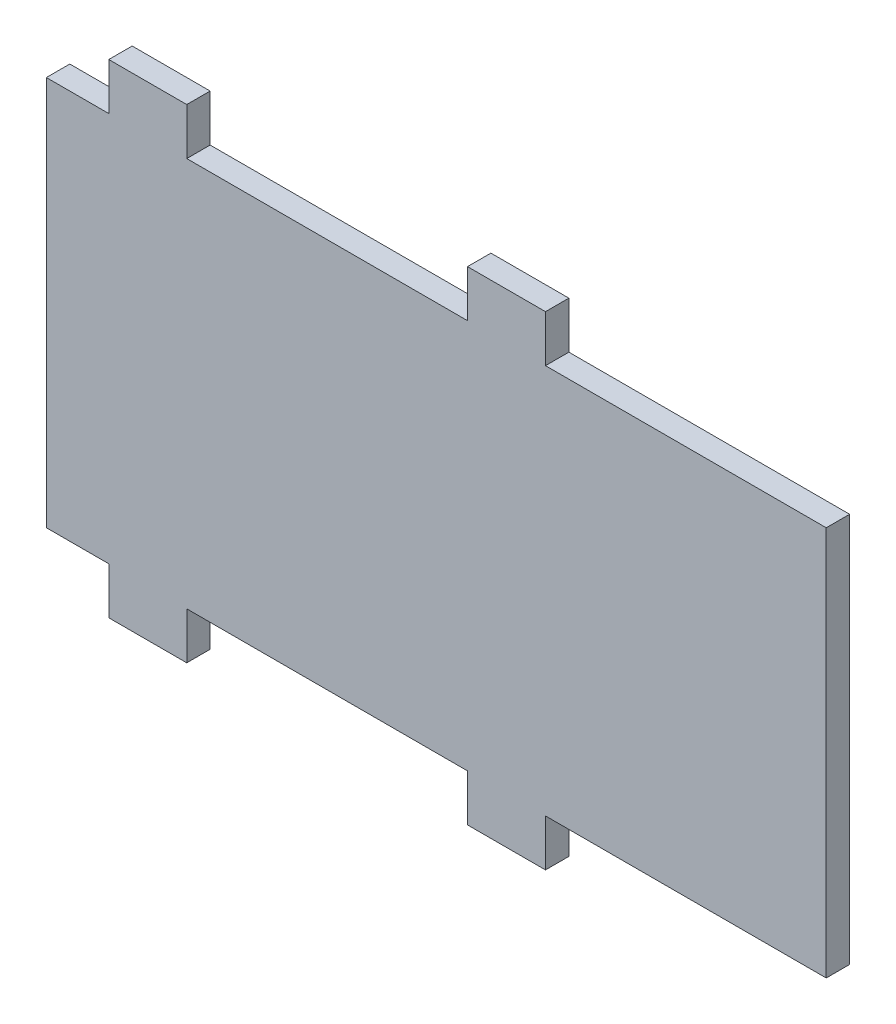
ISO-10303-21;
HEADER;
FILE_DESCRIPTION(('STEP AP214'),'2;1');
FILE_NAME('part.step','',(''),(''),'','','');
FILE_SCHEMA(('AUTOMOTIVE_DESIGN { 1 0 10303 214 1 1 1 1 }'));
ENDSEC;
DATA;
#1=APPLICATION_CONTEXT('core data for automotive mechanical design processes');
#2=APPLICATION_PROTOCOL_DEFINITION('international standard','automotive_design',2000,#1);
#3=PRODUCT_CONTEXT('',#1,'mechanical');
#4=PRODUCT('Part','Part','',(#3));
#5=PRODUCT_RELATED_PRODUCT_CATEGORY('part','',(#4));
#6=PRODUCT_DEFINITION_FORMATION('','',#4);
#7=PRODUCT_DEFINITION_CONTEXT('part definition',#1,'design');
#8=PRODUCT_DEFINITION('design','',#6,#7);
#9=PRODUCT_DEFINITION_SHAPE('','',#8);
#10=(LENGTH_UNIT() NAMED_UNIT(*) SI_UNIT(.MILLI.,.METRE.));
#11=(NAMED_UNIT(*) PLANE_ANGLE_UNIT() SI_UNIT($,.RADIAN.));
#12=(NAMED_UNIT(*) SI_UNIT($,.STERADIAN.) SOLID_ANGLE_UNIT());
#13=UNCERTAINTY_MEASURE_WITH_UNIT(LENGTH_MEASURE(1.E-05),#10,'distance_accuracy_value','');
#14=(GEOMETRIC_REPRESENTATION_CONTEXT(3) GLOBAL_UNCERTAINTY_ASSIGNED_CONTEXT((#13)) GLOBAL_UNIT_ASSIGNED_CONTEXT((#10,
#11,#12)) REPRESENTATION_CONTEXT('',''));
#15=CARTESIAN_POINT('',(0.,0.,0.));
#16=DIRECTION('',(0.,0.,1.));
#17=DIRECTION('',(1.,0.,0.));
#18=AXIS2_PLACEMENT_3D('',#15,#16,#17);
#19=CARTESIAN_POINT('',(-100.,62.,3.));
#20=DIRECTION('',(0.,-1.,0.));
#21=DIRECTION('',(1.,0.,0.));
#22=AXIS2_PLACEMENT_3D('',#19,#20,#21);
#23=PLANE('',#22);
#24=DIRECTION('',(-1.,0.,0.));
#25=VECTOR('',#24,1.);
#26=CARTESIAN_POINT('',(-100.,62.,0.));
#27=LINE('',#26,#25);
#28=CARTESIAN_POINT('',(-36.,62.,0.));
#29=VERTEX_POINT('',#28);
#30=CARTESIAN_POINT('',(-46.,62.,0.));
#31=VERTEX_POINT('',#30);
#32=EDGE_CURVE('E194',#29,#31,#27,.T.);
#33=ORIENTED_EDGE('',*,*,#32,.T.);
#34=DIRECTION('',(0.,0.,1.));
#35=VECTOR('',#34,1.);
#36=CARTESIAN_POINT('',(-46.,62.,0.));
#37=LINE('',#36,#35);
#38=CARTESIAN_POINT('',(-46.,62.,3.));
#39=VERTEX_POINT('',#38);
#40=EDGE_CURVE('E284',#31,#39,#37,.T.);
#41=ORIENTED_EDGE('',*,*,#40,.T.);
#42=DIRECTION('',(-1.,0.,0.));
#43=VECTOR('',#42,1.);
#44=CARTESIAN_POINT('',(-100.,62.,3.));
#45=LINE('',#44,#43);
#46=CARTESIAN_POINT('',(-36.,62.,3.));
#47=VERTEX_POINT('',#46);
#48=EDGE_CURVE('E205',#47,#39,#45,.T.);
#49=ORIENTED_EDGE('',*,*,#48,.F.);
#50=DIRECTION('',(0.,0.,1.));
#51=VECTOR('',#50,1.);
#52=CARTESIAN_POINT('',(-36.,62.,0.));
#53=LINE('',#52,#51);
#54=EDGE_CURVE('E271',#29,#47,#53,.T.);
#55=ORIENTED_EDGE('',*,*,#54,.F.);
#56=EDGE_LOOP('',(#33,#41,#49,#55));
#57=FACE_BOUND('',#56,.T.);
#58=ADVANCED_FACE('F32',(#57),#23,.F.);
#59=CARTESIAN_POINT('',(0.,0.,3.));
#60=DIRECTION('',(0.,1.,0.));
#61=DIRECTION('',(-1.,0.,0.));
#62=AXIS2_PLACEMENT_3D('',#59,#60,#61);
#63=PLANE('',#62);
#64=DIRECTION('',(1.,0.,0.));
#65=VECTOR('',#64,1.);
#66=CARTESIAN_POINT('',(0.,0.,0.));
#67=LINE('',#66,#65);
#68=CARTESIAN_POINT('',(-92.,0.,0.));
#69=VERTEX_POINT('',#68);
#70=CARTESIAN_POINT('',(-82.,0.,0.));
#71=VERTEX_POINT('',#70);
#72=EDGE_CURVE('E36',#69,#71,#67,.T.);
#73=ORIENTED_EDGE('',*,*,#72,.T.);
#74=DIRECTION('',(0.,0.,1.));
#75=VECTOR('',#74,1.);
#76=CARTESIAN_POINT('',(-82.,0.,0.));
#77=LINE('',#76,#75);
#78=CARTESIAN_POINT('',(-82.,0.,3.));
#79=VERTEX_POINT('',#78);
#80=EDGE_CURVE('E227',#71,#79,#77,.T.);
#81=ORIENTED_EDGE('',*,*,#80,.T.);
#82=DIRECTION('',(1.,0.,0.));
#83=VECTOR('',#82,1.);
#84=CARTESIAN_POINT('',(0.,0.,3.));
#85=LINE('',#84,#83);
#86=CARTESIAN_POINT('',(-92.,0.,3.));
#87=VERTEX_POINT('',#86);
#88=EDGE_CURVE('E11',#87,#79,#85,.T.);
#89=ORIENTED_EDGE('',*,*,#88,.F.);
#90=DIRECTION('',(0.,0.,1.));
#91=VECTOR('',#90,1.);
#92=CARTESIAN_POINT('',(-92.,0.,0.));
#93=LINE('',#92,#91);
#94=EDGE_CURVE('E212',#69,#87,#93,.T.);
#95=ORIENTED_EDGE('',*,*,#94,.F.);
#96=EDGE_LOOP('',(#73,#81,#89,#95));
#97=FACE_BOUND('',#96,.T.);
#98=ADVANCED_FACE('F380',(#97),#63,.F.);
#99=CARTESIAN_POINT('',(0.,0.,3.));
#100=DIRECTION('',(-1.,0.,0.));
#101=DIRECTION('',(0.,0.,1.));
#102=AXIS2_PLACEMENT_3D('',#99,#100,#101);
#103=PLANE('',#102);
#104=DIRECTION('',(0.,1.,0.));
#105=VECTOR('',#104,1.);
#106=CARTESIAN_POINT('',(0.,0.,0.));
#107=LINE('',#106,#105);
#108=CARTESIAN_POINT('',(0.,5.99999999999999,0.));
#109=VERTEX_POINT('',#108);
#110=CARTESIAN_POINT('',(0.,56.,0.));
#111=VERTEX_POINT('',#110);
#112=EDGE_CURVE('E200',#109,#111,#107,.T.);
#113=ORIENTED_EDGE('',*,*,#112,.T.);
#114=DIRECTION('',(0.,0.,1.));
#115=VECTOR('',#114,1.);
#116=CARTESIAN_POINT('',(0.,56.,0.));
#117=LINE('',#116,#115);
#118=CARTESIAN_POINT('',(0.,56.,3.));
#119=VERTEX_POINT('',#118);
#120=EDGE_CURVE('E266',#111,#119,#117,.T.);
#121=ORIENTED_EDGE('',*,*,#120,.T.);
#122=DIRECTION('',(0.,1.,0.));
#123=VECTOR('',#122,1.);
#124=CARTESIAN_POINT('',(0.,0.,3.));
#125=LINE('',#124,#123);
#126=CARTESIAN_POINT('',(0.,5.99999999999999,3.));
#127=VERTEX_POINT('',#126);
#128=EDGE_CURVE('E209',#127,#119,#125,.T.);
#129=ORIENTED_EDGE('',*,*,#128,.F.);
#130=DIRECTION('',(0.,0.,1.));
#131=VECTOR('',#130,1.);
#132=CARTESIAN_POINT('',(0.,5.99999999999999,0.));
#133=LINE('',#132,#131);
#134=EDGE_CURVE('E256',#109,#127,#133,.T.);
#135=ORIENTED_EDGE('',*,*,#134,.F.);
#136=EDGE_LOOP('',(#113,#121,#129,#135));
#137=FACE_BOUND('',#136,.T.);
#138=ADVANCED_FACE('F34',(#137),#103,.F.);
#139=CARTESIAN_POINT('',(-82.,62.,0.));
#140=VERTEX_POINT('',#139);
#141=CARTESIAN_POINT('',(-92.,62.,0.));
#142=VERTEX_POINT('',#141);
#143=EDGE_CURVE('E197',#140,#142,#27,.T.);
#144=ORIENTED_EDGE('',*,*,#143,.T.);
#145=DIRECTION('',(0.,0.,1.));
#146=VECTOR('',#145,1.);
#147=CARTESIAN_POINT('',(-92.,62.,0.));
#148=LINE('',#147,#146);
#149=CARTESIAN_POINT('',(-92.,62.,3.));
#150=VERTEX_POINT('',#149);
#151=EDGE_CURVE('E307',#142,#150,#148,.T.);
#152=ORIENTED_EDGE('',*,*,#151,.T.);
#153=CARTESIAN_POINT('',(-82.,62.,3.));
#154=VERTEX_POINT('',#153);
#155=EDGE_CURVE('E208',#154,#150,#45,.T.);
#156=ORIENTED_EDGE('',*,*,#155,.F.);
#157=DIRECTION('',(0.,0.,1.));
#158=VECTOR('',#157,1.);
#159=CARTESIAN_POINT('',(-82.,62.,0.));
#160=LINE('',#159,#158);
#161=EDGE_CURVE('E289',#140,#154,#160,.T.);
#162=ORIENTED_EDGE('',*,*,#161,.F.);
#163=EDGE_LOOP('',(#144,#152,#156,#162));
#164=FACE_BOUND('',#163,.T.);
#165=ADVANCED_FACE('F323',(#164),#23,.F.);
#166=CARTESIAN_POINT('',(-100.,0.,3.));
#167=DIRECTION('',(1.,0.,0.));
#168=DIRECTION('',(0.,0.,-1.));
#169=AXIS2_PLACEMENT_3D('',#166,#167,#168);
#170=PLANE('',#169);
#171=DIRECTION('',(0.,-1.,0.));
#172=VECTOR('',#171,1.);
#173=CARTESIAN_POINT('',(-100.,0.,3.));
#174=LINE('',#173,#172);
#175=CARTESIAN_POINT('',(-100.,56.,3.));
#176=VERTEX_POINT('',#175);
#177=CARTESIAN_POINT('',(-100.,6.,3.));
#178=VERTEX_POINT('',#177);
#179=EDGE_CURVE('E187',#176,#178,#174,.T.);
#180=ORIENTED_EDGE('',*,*,#179,.F.);
#181=DIRECTION('',(0.,0.,1.));
#182=VECTOR('',#181,1.);
#183=CARTESIAN_POINT('',(-100.,56.,0.));
#184=LINE('',#183,#182);
#185=CARTESIAN_POINT('',(-100.,56.,0.));
#186=VERTEX_POINT('',#185);
#187=EDGE_CURVE('E174',#186,#176,#184,.T.);
#188=ORIENTED_EDGE('',*,*,#187,.F.);
#189=DIRECTION('',(0.,-1.,0.));
#190=VECTOR('',#189,1.);
#191=CARTESIAN_POINT('',(-100.,0.,0.));
#192=LINE('',#191,#190);
#193=CARTESIAN_POINT('',(-100.,6.,0.));
#194=VERTEX_POINT('',#193);
#195=EDGE_CURVE('E185',#186,#194,#192,.T.);
#196=ORIENTED_EDGE('',*,*,#195,.T.);
#197=DIRECTION('',(0.,0.,1.));
#198=VECTOR('',#197,1.);
#199=CARTESIAN_POINT('',(-100.,6.,0.));
#200=LINE('',#199,#198);
#201=EDGE_CURVE('E202',#194,#178,#200,.T.);
#202=ORIENTED_EDGE('',*,*,#201,.T.);
#203=EDGE_LOOP('',(#180,#188,#196,#202));
#204=FACE_BOUND('',#203,.T.);
#205=ADVANCED_FACE('F183',(#204),#170,.F.);
#206=CARTESIAN_POINT('',(-46.,0.,0.));
#207=VERTEX_POINT('',#206);
#208=CARTESIAN_POINT('',(-36.,0.,0.));
#209=VERTEX_POINT('',#208);
#210=EDGE_CURVE('E193',#207,#209,#67,.T.);
#211=ORIENTED_EDGE('',*,*,#210,.T.);
#212=DIRECTION('',(0.,0.,1.));
#213=VECTOR('',#212,1.);
#214=CARTESIAN_POINT('',(-36.,0.,0.));
#215=LINE('',#214,#213);
#216=CARTESIAN_POINT('',(-36.,0.,3.));
#217=VERTEX_POINT('',#216);
#218=EDGE_CURVE('E253',#209,#217,#215,.T.);
#219=ORIENTED_EDGE('',*,*,#218,.T.);
#220=CARTESIAN_POINT('',(-46.,0.,3.));
#221=VERTEX_POINT('',#220);
#222=EDGE_CURVE('E41',#221,#217,#85,.T.);
#223=ORIENTED_EDGE('',*,*,#222,.F.);
#224=DIRECTION('',(0.,0.,1.));
#225=VECTOR('',#224,1.);
#226=CARTESIAN_POINT('',(-46.,0.,0.));
#227=LINE('',#226,#225);
#228=EDGE_CURVE('E230',#207,#221,#227,.T.);
#229=ORIENTED_EDGE('',*,*,#228,.F.);
#230=EDGE_LOOP('',(#211,#219,#223,#229));
#231=FACE_BOUND('',#230,.T.);
#232=ADVANCED_FACE('F363',(#231),#63,.F.);
#233=CARTESIAN_POINT('',(0.,0.,3.));
#234=DIRECTION('',(0.,0.,-1.));
#235=DIRECTION('',(-1.,0.,0.));
#236=AXIS2_PLACEMENT_3D('',#233,#234,#235);
#237=PLANE('',#236);
#238=ORIENTED_EDGE('',*,*,#155,.T.);
#239=DIRECTION('',(0.,1.,0.));
#240=VECTOR('',#239,1.);
#241=CARTESIAN_POINT('',(-92.,62.,3.));
#242=LINE('',#241,#240);
#243=CARTESIAN_POINT('',(-92.,56.,3.));
#244=VERTEX_POINT('',#243);
#245=EDGE_CURVE('E179',#244,#150,#242,.T.);
#246=ORIENTED_EDGE('',*,*,#245,.F.);
#247=DIRECTION('',(1.,0.,0.));
#248=VECTOR('',#247,1.);
#249=CARTESIAN_POINT('',(-100.,56.,3.));
#250=LINE('',#249,#248);
#251=EDGE_CURVE('E317',#176,#244,#250,.T.);
#252=ORIENTED_EDGE('',*,*,#251,.F.);
#253=ORIENTED_EDGE('',*,*,#179,.T.);
#254=DIRECTION('',(-1.,0.,0.));
#255=VECTOR('',#254,1.);
#256=CARTESIAN_POINT('',(-100.,6.,3.));
#257=LINE('',#256,#255);
#258=CARTESIAN_POINT('',(-92.,6.,3.));
#259=VERTEX_POINT('',#258);
#260=EDGE_CURVE('E217',#259,#178,#257,.T.);
#261=ORIENTED_EDGE('',*,*,#260,.F.);
#262=DIRECTION('',(0.,1.,0.));
#263=VECTOR('',#262,1.);
#264=CARTESIAN_POINT('',(-92.,0.,3.));
#265=LINE('',#264,#263);
#266=EDGE_CURVE('E221',#87,#259,#265,.T.);
#267=ORIENTED_EDGE('',*,*,#266,.F.);
#268=ORIENTED_EDGE('',*,*,#88,.T.);
#269=DIRECTION('',(0.,-1.,0.));
#270=VECTOR('',#269,1.);
#271=CARTESIAN_POINT('',(-82.,0.,3.));
#272=LINE('',#271,#270);
#273=CARTESIAN_POINT('',(-82.,5.99999999999998,3.));
#274=VERTEX_POINT('',#273);
#275=EDGE_CURVE('E243',#274,#79,#272,.T.);
#276=ORIENTED_EDGE('',*,*,#275,.F.);
#277=DIRECTION('',(-1.,0.,0.));
#278=VECTOR('',#277,1.);
#279=CARTESIAN_POINT('',(-82.,5.99999999999998,3.));
#280=LINE('',#279,#278);
#281=CARTESIAN_POINT('',(-46.,5.99999999999999,3.));
#282=VERTEX_POINT('',#281);
#283=EDGE_CURVE('E236',#282,#274,#280,.T.);
#284=ORIENTED_EDGE('',*,*,#283,.F.);
#285=DIRECTION('',(0.,1.,0.));
#286=VECTOR('',#285,1.);
#287=CARTESIAN_POINT('',(-46.,0.,3.));
#288=LINE('',#287,#286);
#289=EDGE_CURVE('E240',#221,#282,#288,.T.);
#290=ORIENTED_EDGE('',*,*,#289,.F.);
#291=ORIENTED_EDGE('',*,*,#222,.T.);
#292=DIRECTION('',(0.,-1.,0.));
#293=VECTOR('',#292,1.);
#294=CARTESIAN_POINT('',(-36.,0.,3.));
#295=LINE('',#294,#293);
#296=CARTESIAN_POINT('',(-36.,5.99999999999999,3.));
#297=VERTEX_POINT('',#296);
#298=EDGE_CURVE('E264',#297,#217,#295,.T.);
#299=ORIENTED_EDGE('',*,*,#298,.F.);
#300=DIRECTION('',(-1.,0.,0.));
#301=VECTOR('',#300,1.);
#302=CARTESIAN_POINT('',(-36.,5.99999999999999,3.));
#303=LINE('',#302,#301);
#304=EDGE_CURVE('E260',#127,#297,#303,.T.);
#305=ORIENTED_EDGE('',*,*,#304,.F.);
#306=ORIENTED_EDGE('',*,*,#128,.T.);
#307=DIRECTION('',(1.,0.,0.));
#308=VECTOR('',#307,1.);
#309=CARTESIAN_POINT('',(-36.,56.,3.));
#310=LINE('',#309,#308);
#311=CARTESIAN_POINT('',(-36.,56.,3.));
#312=VERTEX_POINT('',#311);
#313=EDGE_CURVE('E278',#312,#119,#310,.T.);
#314=ORIENTED_EDGE('',*,*,#313,.F.);
#315=DIRECTION('',(0.,-1.,0.));
#316=VECTOR('',#315,1.);
#317=CARTESIAN_POINT('',(-36.,62.,3.));
#318=LINE('',#317,#316);
#319=EDGE_CURVE('E281',#47,#312,#318,.T.);
#320=ORIENTED_EDGE('',*,*,#319,.F.);
#321=ORIENTED_EDGE('',*,*,#48,.T.);
#322=DIRECTION('',(0.,1.,0.));
#323=VECTOR('',#322,1.);
#324=CARTESIAN_POINT('',(-46.,62.,3.));
#325=LINE('',#324,#323);
#326=CARTESIAN_POINT('',(-46.,56.,3.));
#327=VERTEX_POINT('',#326);
#328=EDGE_CURVE('E298',#327,#39,#325,.T.);
#329=ORIENTED_EDGE('',*,*,#328,.F.);
#330=DIRECTION('',(1.,0.,0.));
#331=VECTOR('',#330,1.);
#332=CARTESIAN_POINT('',(-82.,56.,3.));
#333=LINE('',#332,#331);
#334=CARTESIAN_POINT('',(-82.,56.,3.));
#335=VERTEX_POINT('',#334);
#336=EDGE_CURVE('E301',#335,#327,#333,.T.);
#337=ORIENTED_EDGE('',*,*,#336,.F.);
#338=DIRECTION('',(0.,-1.,0.));
#339=VECTOR('',#338,1.);
#340=CARTESIAN_POINT('',(-82.,62.,3.));
#341=LINE('',#340,#339);
#342=EDGE_CURVE('E304',#154,#335,#341,.T.);
#343=ORIENTED_EDGE('',*,*,#342,.F.);
#344=EDGE_LOOP('',(#238,#246,#252,#253,#261,#267,#268,#276,#284,#290,#291,#299,#305,#306,#314,
#320,#321,#329,#337,#343));
#345=FACE_BOUND('',#344,.T.);
#346=ADVANCED_FACE('F331',(#345),#237,.F.);
#347=CARTESIAN_POINT('',(0.,0.,0.));
#348=DIRECTION('',(0.,0.,-1.));
#349=DIRECTION('',(-1.,0.,0.));
#350=AXIS2_PLACEMENT_3D('',#347,#348,#349);
#351=PLANE('',#350);
#352=DIRECTION('',(0.,1.,0.));
#353=VECTOR('',#352,1.);
#354=CARTESIAN_POINT('',(-92.,62.,0.));
#355=LINE('',#354,#353);
#356=CARTESIAN_POINT('',(-92.,56.,0.));
#357=VERTEX_POINT('',#356);
#358=EDGE_CURVE('E49',#357,#142,#355,.T.);
#359=ORIENTED_EDGE('',*,*,#358,.T.);
#360=ORIENTED_EDGE('',*,*,#143,.F.);
#361=DIRECTION('',(0.,-1.,0.));
#362=VECTOR('',#361,1.);
#363=CARTESIAN_POINT('',(-82.,62.,0.));
#364=LINE('',#363,#362);
#365=CARTESIAN_POINT('',(-82.,56.,0.));
#366=VERTEX_POINT('',#365);
#367=EDGE_CURVE('E300',#140,#366,#364,.T.);
#368=ORIENTED_EDGE('',*,*,#367,.T.);
#369=DIRECTION('',(1.,0.,0.));
#370=VECTOR('',#369,1.);
#371=CARTESIAN_POINT('',(-82.,56.,0.));
#372=LINE('',#371,#370);
#373=CARTESIAN_POINT('',(-46.,56.,0.));
#374=VERTEX_POINT('',#373);
#375=EDGE_CURVE('E57',#366,#374,#372,.T.);
#376=ORIENTED_EDGE('',*,*,#375,.T.);
#377=DIRECTION('',(0.,1.,0.));
#378=VECTOR('',#377,1.);
#379=CARTESIAN_POINT('',(-46.,62.,0.));
#380=LINE('',#379,#378);
#381=EDGE_CURVE('E292',#374,#31,#380,.T.);
#382=ORIENTED_EDGE('',*,*,#381,.T.);
#383=ORIENTED_EDGE('',*,*,#32,.F.);
#384=DIRECTION('',(0.,-1.,0.));
#385=VECTOR('',#384,1.);
#386=CARTESIAN_POINT('',(-36.,62.,0.));
#387=LINE('',#386,#385);
#388=CARTESIAN_POINT('',(-36.,56.,0.));
#389=VERTEX_POINT('',#388);
#390=EDGE_CURVE('E280',#29,#389,#387,.T.);
#391=ORIENTED_EDGE('',*,*,#390,.T.);
#392=DIRECTION('',(1.,0.,0.));
#393=VECTOR('',#392,1.);
#394=CARTESIAN_POINT('',(-36.,56.,0.));
#395=LINE('',#394,#393);
#396=EDGE_CURVE('E274',#389,#111,#395,.T.);
#397=ORIENTED_EDGE('',*,*,#396,.T.);
#398=ORIENTED_EDGE('',*,*,#112,.F.);
#399=DIRECTION('',(-1.,0.,0.));
#400=VECTOR('',#399,1.);
#401=CARTESIAN_POINT('',(-36.,5.99999999999999,0.));
#402=LINE('',#401,#400);
#403=CARTESIAN_POINT('',(-36.,5.99999999999999,0.));
#404=VERTEX_POINT('',#403);
#405=EDGE_CURVE('E257',#109,#404,#402,.T.);
#406=ORIENTED_EDGE('',*,*,#405,.T.);
#407=DIRECTION('',(0.,-1.,0.));
#408=VECTOR('',#407,1.);
#409=CARTESIAN_POINT('',(-36.,0.,0.));
#410=LINE('',#409,#408);
#411=EDGE_CURVE('E263',#404,#209,#410,.T.);
#412=ORIENTED_EDGE('',*,*,#411,.T.);
#413=ORIENTED_EDGE('',*,*,#210,.F.);
#414=DIRECTION('',(0.,1.,0.));
#415=VECTOR('',#414,1.);
#416=CARTESIAN_POINT('',(-46.,0.,0.));
#417=LINE('',#416,#415);
#418=CARTESIAN_POINT('',(-46.,5.99999999999999,0.));
#419=VERTEX_POINT('',#418);
#420=EDGE_CURVE('E248',#207,#419,#417,.T.);
#421=ORIENTED_EDGE('',*,*,#420,.T.);
#422=DIRECTION('',(-1.,0.,0.));
#423=VECTOR('',#422,1.);
#424=CARTESIAN_POINT('',(-82.,5.99999999999998,0.));
#425=LINE('',#424,#423);
#426=CARTESIAN_POINT('',(-82.,5.99999999999998,0.));
#427=VERTEX_POINT('',#426);
#428=EDGE_CURVE('E231',#419,#427,#425,.T.);
#429=ORIENTED_EDGE('',*,*,#428,.T.);
#430=DIRECTION('',(0.,-1.,0.));
#431=VECTOR('',#430,1.);
#432=CARTESIAN_POINT('',(-82.,0.,0.));
#433=LINE('',#432,#431);
#434=EDGE_CURVE('E239',#427,#71,#433,.T.);
#435=ORIENTED_EDGE('',*,*,#434,.T.);
#436=ORIENTED_EDGE('',*,*,#72,.F.);
#437=DIRECTION('',(0.,1.,0.));
#438=VECTOR('',#437,1.);
#439=CARTESIAN_POINT('',(-92.,0.,0.));
#440=LINE('',#439,#438);
#441=CARTESIAN_POINT('',(-92.,6.,0.));
#442=VERTEX_POINT('',#441);
#443=EDGE_CURVE('E220',#69,#442,#440,.T.);
#444=ORIENTED_EDGE('',*,*,#443,.T.);
#445=DIRECTION('',(-1.,0.,0.));
#446=VECTOR('',#445,1.);
#447=CARTESIAN_POINT('',(-100.,6.,0.));
#448=LINE('',#447,#446);
#449=EDGE_CURVE('E192',#442,#194,#448,.T.);
#450=ORIENTED_EDGE('',*,*,#449,.T.);
#451=ORIENTED_EDGE('',*,*,#195,.F.);
#452=DIRECTION('',(1.,0.,0.));
#453=VECTOR('',#452,1.);
#454=CARTESIAN_POINT('',(-100.,56.,0.));
#455=LINE('',#454,#453);
#456=EDGE_CURVE('E170',#186,#357,#455,.T.);
#457=ORIENTED_EDGE('',*,*,#456,.T.);
#458=EDGE_LOOP('',(#359,#360,#368,#376,#382,#383,#391,#397,#398,#406,#412,#413,#421,#429,#435,
#436,#444,#450,#451,#457));
#459=FACE_BOUND('',#458,.T.);
#460=ADVANCED_FACE('F190',(#459),#351,.T.);
#461=CARTESIAN_POINT('',(-100.,6.,0.));
#462=DIRECTION('',(0.,1.,0.));
#463=DIRECTION('',(0.,0.,1.));
#464=AXIS2_PLACEMENT_3D('',#461,#462,#463);
#465=PLANE('',#464);
#466=ORIENTED_EDGE('',*,*,#260,.T.);
#467=ORIENTED_EDGE('',*,*,#201,.F.);
#468=ORIENTED_EDGE('',*,*,#449,.F.);
#469=DIRECTION('',(0.,0.,1.));
#470=VECTOR('',#469,1.);
#471=CARTESIAN_POINT('',(-92.,6.,0.));
#472=LINE('',#471,#470);
#473=EDGE_CURVE('E214',#442,#259,#472,.T.);
#474=ORIENTED_EDGE('',*,*,#473,.T.);
#475=EDGE_LOOP('',(#466,#467,#468,#474));
#476=FACE_BOUND('',#475,.T.);
#477=ADVANCED_FACE('F388',(#476),#465,.F.);
#478=CARTESIAN_POINT('',(-92.,0.,0.));
#479=DIRECTION('',(1.,0.,0.));
#480=DIRECTION('',(0.,0.,-1.));
#481=AXIS2_PLACEMENT_3D('',#478,#479,#480);
#482=PLANE('',#481);
#483=ORIENTED_EDGE('',*,*,#266,.T.);
#484=ORIENTED_EDGE('',*,*,#473,.F.);
#485=ORIENTED_EDGE('',*,*,#443,.F.);
#486=ORIENTED_EDGE('',*,*,#94,.T.);
#487=EDGE_LOOP('',(#483,#484,#485,#486));
#488=FACE_BOUND('',#487,.T.);
#489=ADVANCED_FACE('F386',(#488),#482,.F.);
#490=CARTESIAN_POINT('',(-82.,0.,0.));
#491=DIRECTION('',(-1.,0.,0.));
#492=DIRECTION('',(0.,0.,1.));
#493=AXIS2_PLACEMENT_3D('',#490,#491,#492);
#494=PLANE('',#493);
#495=ORIENTED_EDGE('',*,*,#275,.T.);
#496=ORIENTED_EDGE('',*,*,#80,.F.);
#497=ORIENTED_EDGE('',*,*,#434,.F.);
#498=DIRECTION('',(0.,0.,1.));
#499=VECTOR('',#498,1.);
#500=CARTESIAN_POINT('',(-82.,5.99999999999998,0.));
#501=LINE('',#500,#499);
#502=EDGE_CURVE('E224',#427,#274,#501,.T.);
#503=ORIENTED_EDGE('',*,*,#502,.T.);
#504=EDGE_LOOP('',(#495,#496,#497,#503));
#505=FACE_BOUND('',#504,.T.);
#506=ADVANCED_FACE('F377',(#505),#494,.F.);
#507=CARTESIAN_POINT('',(-82.,5.99999999999998,0.));
#508=DIRECTION('',(0.,1.,0.));
#509=DIRECTION('',(-1.,0.,0.));
#510=AXIS2_PLACEMENT_3D('',#507,#508,#509);
#511=PLANE('',#510);
#512=ORIENTED_EDGE('',*,*,#283,.T.);
#513=ORIENTED_EDGE('',*,*,#502,.F.);
#514=ORIENTED_EDGE('',*,*,#428,.F.);
#515=DIRECTION('',(0.,0.,1.));
#516=VECTOR('',#515,1.);
#517=CARTESIAN_POINT('',(-46.,5.99999999999999,0.));
#518=LINE('',#517,#516);
#519=EDGE_CURVE('E233',#419,#282,#518,.T.);
#520=ORIENTED_EDGE('',*,*,#519,.T.);
#521=EDGE_LOOP('',(#512,#513,#514,#520));
#522=FACE_BOUND('',#521,.T.);
#523=ADVANCED_FACE('F375',(#522),#511,.F.);
#524=CARTESIAN_POINT('',(-46.,0.,0.));
#525=DIRECTION('',(1.,0.,0.));
#526=DIRECTION('',(0.,1.,0.));
#527=AXIS2_PLACEMENT_3D('',#524,#525,#526);
#528=PLANE('',#527);
#529=ORIENTED_EDGE('',*,*,#289,.T.);
#530=ORIENTED_EDGE('',*,*,#519,.F.);
#531=ORIENTED_EDGE('',*,*,#420,.F.);
#532=ORIENTED_EDGE('',*,*,#228,.T.);
#533=EDGE_LOOP('',(#529,#530,#531,#532));
#534=FACE_BOUND('',#533,.T.);
#535=ADVANCED_FACE('F370',(#534),#528,.F.);
#536=CARTESIAN_POINT('',(-36.,0.,0.));
#537=DIRECTION('',(-1.,0.,0.));
#538=DIRECTION('',(0.,-1.,0.));
#539=AXIS2_PLACEMENT_3D('',#536,#537,#538);
#540=PLANE('',#539);
#541=ORIENTED_EDGE('',*,*,#298,.T.);
#542=ORIENTED_EDGE('',*,*,#218,.F.);
#543=ORIENTED_EDGE('',*,*,#411,.F.);
#544=DIRECTION('',(0.,0.,1.));
#545=VECTOR('',#544,1.);
#546=CARTESIAN_POINT('',(-36.,5.99999999999999,0.));
#547=LINE('',#546,#545);
#548=EDGE_CURVE('E245',#404,#297,#547,.T.);
#549=ORIENTED_EDGE('',*,*,#548,.T.);
#550=EDGE_LOOP('',(#541,#542,#543,#549));
#551=FACE_BOUND('',#550,.T.);
#552=ADVANCED_FACE('F359',(#551),#540,.F.);
#553=CARTESIAN_POINT('',(-36.,5.99999999999999,0.));
#554=DIRECTION('',(0.,1.,0.));
#555=DIRECTION('',(-1.,0.,0.));
#556=AXIS2_PLACEMENT_3D('',#553,#554,#555);
#557=PLANE('',#556);
#558=ORIENTED_EDGE('',*,*,#304,.T.);
#559=ORIENTED_EDGE('',*,*,#548,.F.);
#560=ORIENTED_EDGE('',*,*,#405,.F.);
#561=ORIENTED_EDGE('',*,*,#134,.T.);
#562=EDGE_LOOP('',(#558,#559,#560,#561));
#563=FACE_BOUND('',#562,.T.);
#564=ADVANCED_FACE('F356',(#563),#557,.F.);
#565=CARTESIAN_POINT('',(-36.,56.,0.));
#566=DIRECTION('',(0.,-1.,0.));
#567=DIRECTION('',(0.,0.,-1.));
#568=AXIS2_PLACEMENT_3D('',#565,#566,#567);
#569=PLANE('',#568);
#570=ORIENTED_EDGE('',*,*,#313,.T.);
#571=ORIENTED_EDGE('',*,*,#120,.F.);
#572=ORIENTED_EDGE('',*,*,#396,.F.);
#573=DIRECTION('',(0.,0.,1.));
#574=VECTOR('',#573,1.);
#575=CARTESIAN_POINT('',(-36.,56.,0.));
#576=LINE('',#575,#574);
#577=EDGE_CURVE('E273',#389,#312,#576,.T.);
#578=ORIENTED_EDGE('',*,*,#577,.T.);
#579=EDGE_LOOP('',(#570,#571,#572,#578));
#580=FACE_BOUND('',#579,.T.);
#581=ADVANCED_FACE('F349',(#580),#569,.F.);
#582=CARTESIAN_POINT('',(-36.,62.,0.));
#583=DIRECTION('',(-1.,0.,0.));
#584=DIRECTION('',(0.,-1.,0.));
#585=AXIS2_PLACEMENT_3D('',#582,#583,#584);
#586=PLANE('',#585);
#587=ORIENTED_EDGE('',*,*,#319,.T.);
#588=ORIENTED_EDGE('',*,*,#577,.F.);
#589=ORIENTED_EDGE('',*,*,#390,.F.);
#590=ORIENTED_EDGE('',*,*,#54,.T.);
#591=EDGE_LOOP('',(#587,#588,#589,#590));
#592=FACE_BOUND('',#591,.T.);
#593=ADVANCED_FACE('F343',(#592),#586,.F.);
#594=CARTESIAN_POINT('',(-46.,62.,0.));
#595=DIRECTION('',(1.,0.,0.));
#596=DIRECTION('',(0.,1.,0.));
#597=AXIS2_PLACEMENT_3D('',#594,#595,#596);
#598=PLANE('',#597);
#599=ORIENTED_EDGE('',*,*,#328,.T.);
#600=ORIENTED_EDGE('',*,*,#40,.F.);
#601=ORIENTED_EDGE('',*,*,#381,.F.);
#602=DIRECTION('',(0.,0.,1.));
#603=VECTOR('',#602,1.);
#604=CARTESIAN_POINT('',(-46.,56.,0.));
#605=LINE('',#604,#603);
#606=EDGE_CURVE('E294',#374,#327,#605,.T.);
#607=ORIENTED_EDGE('',*,*,#606,.T.);
#608=EDGE_LOOP('',(#599,#600,#601,#607));
#609=FACE_BOUND('',#608,.T.);
#610=ADVANCED_FACE('F481',(#609),#598,.F.);
#611=CARTESIAN_POINT('',(-82.,56.,0.));
#612=DIRECTION('',(0.,-1.,0.));
#613=DIRECTION('',(1.,0.,0.));
#614=AXIS2_PLACEMENT_3D('',#611,#612,#613);
#615=PLANE('',#614);
#616=ORIENTED_EDGE('',*,*,#336,.T.);
#617=ORIENTED_EDGE('',*,*,#606,.F.);
#618=ORIENTED_EDGE('',*,*,#375,.F.);
#619=DIRECTION('',(0.,0.,1.));
#620=VECTOR('',#619,1.);
#621=CARTESIAN_POINT('',(-82.,56.,0.));
#622=LINE('',#621,#620);
#623=EDGE_CURVE('E291',#366,#335,#622,.T.);
#624=ORIENTED_EDGE('',*,*,#623,.T.);
#625=EDGE_LOOP('',(#616,#617,#618,#624));
#626=FACE_BOUND('',#625,.T.);
#627=ADVANCED_FACE('F334',(#626),#615,.F.);
#628=CARTESIAN_POINT('',(-82.,62.,0.));
#629=DIRECTION('',(-1.,0.,0.));
#630=DIRECTION('',(0.,0.,1.));
#631=AXIS2_PLACEMENT_3D('',#628,#629,#630);
#632=PLANE('',#631);
#633=ORIENTED_EDGE('',*,*,#342,.T.);
#634=ORIENTED_EDGE('',*,*,#623,.F.);
#635=ORIENTED_EDGE('',*,*,#367,.F.);
#636=ORIENTED_EDGE('',*,*,#161,.T.);
#637=EDGE_LOOP('',(#633,#634,#635,#636));
#638=FACE_BOUND('',#637,.T.);
#639=ADVANCED_FACE('F328',(#638),#632,.F.);
#640=CARTESIAN_POINT('',(-92.,62.,0.));
#641=DIRECTION('',(1.,0.,0.));
#642=DIRECTION('',(0.,0.,-1.));
#643=AXIS2_PLACEMENT_3D('',#640,#641,#642);
#644=PLANE('',#643);
#645=ORIENTED_EDGE('',*,*,#245,.T.);
#646=ORIENTED_EDGE('',*,*,#151,.F.);
#647=ORIENTED_EDGE('',*,*,#358,.F.);
#648=DIRECTION('',(0.,0.,1.));
#649=VECTOR('',#648,1.);
#650=CARTESIAN_POINT('',(-92.,56.,0.));
#651=LINE('',#650,#649);
#652=EDGE_CURVE('E176',#357,#244,#651,.T.);
#653=ORIENTED_EDGE('',*,*,#652,.T.);
#654=EDGE_LOOP('',(#645,#646,#647,#653));
#655=FACE_BOUND('',#654,.T.);
#656=ADVANCED_FACE('F503',(#655),#644,.F.);
#657=CARTESIAN_POINT('',(-100.,56.,0.));
#658=DIRECTION('',(0.,-1.,0.));
#659=DIRECTION('',(1.,0.,0.));
#660=AXIS2_PLACEMENT_3D('',#657,#658,#659);
#661=PLANE('',#660);
#662=ORIENTED_EDGE('',*,*,#251,.T.);
#663=ORIENTED_EDGE('',*,*,#652,.F.);
#664=ORIENTED_EDGE('',*,*,#456,.F.);
#665=ORIENTED_EDGE('',*,*,#187,.T.);
#666=EDGE_LOOP('',(#662,#663,#664,#665));
#667=FACE_BOUND('',#666,.T.);
#668=ADVANCED_FACE('F173',(#667),#661,.F.);
#669=CLOSED_SHELL('',(#58,#98,#138,#165,#205,#232,#346,#460,#477,#489,#506,#523,#535,#552,#564,
#581,#593,#610,#627,#639,#656,#668));
#670=MANIFOLD_SOLID_BREP('B2',#669);
#671=ADVANCED_BREP_SHAPE_REPRESENTATION('',(#18,#670),#14);
#672=SHAPE_DEFINITION_REPRESENTATION(#9,#671);
ENDSEC;
END-ISO-10303-21;
